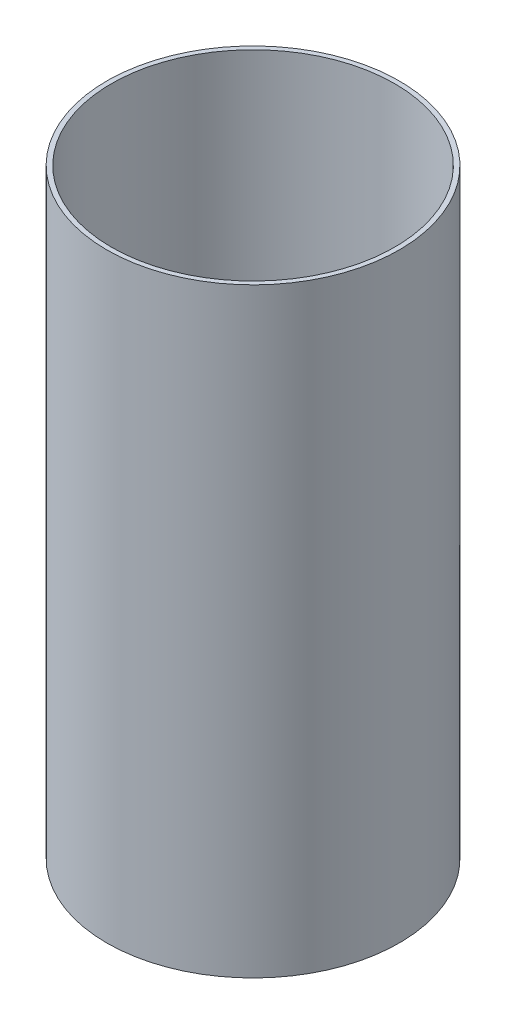
ISO-10303-21;
HEADER;
FILE_DESCRIPTION(('STEP AP214'),'2;1');
FILE_NAME('part.step','',(''),(''),'','','');
FILE_SCHEMA(('AUTOMOTIVE_DESIGN { 1 0 10303 214 1 1 1 1 }'));
ENDSEC;
DATA;
#1=APPLICATION_CONTEXT('core data for automotive mechanical design processes');
#2=APPLICATION_PROTOCOL_DEFINITION('international standard','automotive_design',2000,#1);
#3=PRODUCT_CONTEXT('',#1,'mechanical');
#4=PRODUCT('Part','Part','',(#3));
#5=PRODUCT_RELATED_PRODUCT_CATEGORY('part','',(#4));
#6=PRODUCT_DEFINITION_FORMATION('','',#4);
#7=PRODUCT_DEFINITION_CONTEXT('part definition',#1,'design');
#8=PRODUCT_DEFINITION('design','',#6,#7);
#9=PRODUCT_DEFINITION_SHAPE('','',#8);
#10=(LENGTH_UNIT() NAMED_UNIT(*) SI_UNIT(.MILLI.,.METRE.));
#11=(NAMED_UNIT(*) PLANE_ANGLE_UNIT() SI_UNIT($,.RADIAN.));
#12=(NAMED_UNIT(*) SI_UNIT($,.STERADIAN.) SOLID_ANGLE_UNIT());
#13=UNCERTAINTY_MEASURE_WITH_UNIT(LENGTH_MEASURE(1.E-05),#10,'distance_accuracy_value','');
#14=(GEOMETRIC_REPRESENTATION_CONTEXT(3) GLOBAL_UNCERTAINTY_ASSIGNED_CONTEXT((#13)) GLOBAL_UNIT_ASSIGNED_CONTEXT((#10,
#11,#12)) REPRESENTATION_CONTEXT('',''));
#15=CARTESIAN_POINT('',(0.,0.,0.));
#16=DIRECTION('',(0.,0.,1.));
#17=DIRECTION('',(1.,0.,0.));
#18=AXIS2_PLACEMENT_3D('',#15,#16,#17);
#19=CARTESIAN_POINT('',(0.,203.2,0.));
#20=DIRECTION('',(0.,1.,0.));
#21=DIRECTION('',(0.,0.,1.));
#22=AXIS2_PLACEMENT_3D('',#19,#20,#21);
#23=PLANE('',#22);
#24=CARTESIAN_POINT('',(0.,203.2,0.));
#25=DIRECTION('',(0.,1.,0.));
#26=DIRECTION('',(0.,0.,1.));
#27=AXIS2_PLACEMENT_3D('',#24,#25,#26);
#28=CIRCLE('',#27,49.53);
#29=CARTESIAN_POINT('',(0.,203.2,49.53));
#30=VERTEX_POINT('',#29);
#31=EDGE_CURVE('E10',#30,#30,#28,.T.);
#32=ORIENTED_EDGE('',*,*,#31,.T.);
#33=EDGE_LOOP('',(#32));
#34=FACE_BOUND('',#33,.T.);
#35=CARTESIAN_POINT('',(0.,203.2,0.));
#36=DIRECTION('',(0.,1.,0.));
#37=DIRECTION('',(0.,0.,1.));
#38=AXIS2_PLACEMENT_3D('',#35,#36,#37);
#39=CIRCLE('',#38,47.9552);
#40=CARTESIAN_POINT('',(0.,203.2,47.9552));
#41=VERTEX_POINT('',#40);
#42=EDGE_CURVE('E50',#41,#41,#39,.T.);
#43=ORIENTED_EDGE('',*,*,#42,.F.);
#44=EDGE_LOOP('',(#43));
#45=FACE_BOUND('',#44,.T.);
#46=ADVANCED_FACE('F39',(#34,#45),#23,.T.);
#47=CARTESIAN_POINT('',(0.,0.,0.));
#48=DIRECTION('',(0.,1.,0.));
#49=DIRECTION('',(0.,0.,1.));
#50=AXIS2_PLACEMENT_3D('',#47,#48,#49);
#51=PLANE('',#50);
#52=CARTESIAN_POINT('',(0.,0.,0.));
#53=DIRECTION('',(0.,1.,0.));
#54=DIRECTION('',(0.,0.,1.));
#55=AXIS2_PLACEMENT_3D('',#52,#53,#54);
#56=CIRCLE('',#55,49.53);
#57=CARTESIAN_POINT('',(0.,0.,49.53));
#58=VERTEX_POINT('',#57);
#59=EDGE_CURVE('E43',#58,#58,#56,.T.);
#60=ORIENTED_EDGE('',*,*,#59,.F.);
#61=EDGE_LOOP('',(#60));
#62=FACE_BOUND('',#61,.T.);
#63=CARTESIAN_POINT('',(0.,0.,0.));
#64=DIRECTION('',(0.,1.,0.));
#65=DIRECTION('',(0.,0.,1.));
#66=AXIS2_PLACEMENT_3D('',#63,#64,#65);
#67=CIRCLE('',#66,47.9552);
#68=CARTESIAN_POINT('',(0.,0.,47.9552));
#69=VERTEX_POINT('',#68);
#70=EDGE_CURVE('E52',#69,#69,#67,.T.);
#71=ORIENTED_EDGE('',*,*,#70,.T.);
#72=EDGE_LOOP('',(#71));
#73=FACE_BOUND('',#72,.T.);
#74=ADVANCED_FACE('F62',(#62,#73),#51,.F.);
#75=CARTESIAN_POINT('',(0.,203.2,0.));
#76=DIRECTION('',(0.,-1.,0.));
#77=DIRECTION('',(0.,0.,-1.));
#78=AXIS2_PLACEMENT_3D('',#75,#76,#77);
#79=CYLINDRICAL_SURFACE('',#78,49.53);
#80=ORIENTED_EDGE('',*,*,#31,.F.);
#81=EDGE_LOOP('',(#80));
#82=FACE_BOUND('',#81,.T.);
#83=ORIENTED_EDGE('',*,*,#59,.T.);
#84=EDGE_LOOP('',(#83));
#85=FACE_BOUND('',#84,.T.);
#86=ADVANCED_FACE('F41',(#82,#85),#79,.T.);
#87=CARTESIAN_POINT('',(0.,203.2,0.));
#88=DIRECTION('',(0.,-1.,0.));
#89=DIRECTION('',(0.,0.,-1.));
#90=AXIS2_PLACEMENT_3D('',#87,#88,#89);
#91=CYLINDRICAL_SURFACE('',#90,47.9552);
#92=ORIENTED_EDGE('',*,*,#42,.T.);
#93=EDGE_LOOP('',(#92));
#94=FACE_BOUND('',#93,.T.);
#95=ORIENTED_EDGE('',*,*,#70,.F.);
#96=EDGE_LOOP('',(#95));
#97=FACE_BOUND('',#96,.T.);
#98=ADVANCED_FACE('F58',(#94,#97),#91,.F.);
#99=CLOSED_SHELL('',(#46,#74,#86,#98));
#100=MANIFOLD_SOLID_BREP('B2',#99);
#101=ADVANCED_BREP_SHAPE_REPRESENTATION('',(#18,#100),#14);
#102=SHAPE_DEFINITION_REPRESENTATION(#9,#101);
ENDSEC;
END-ISO-10303-21;
